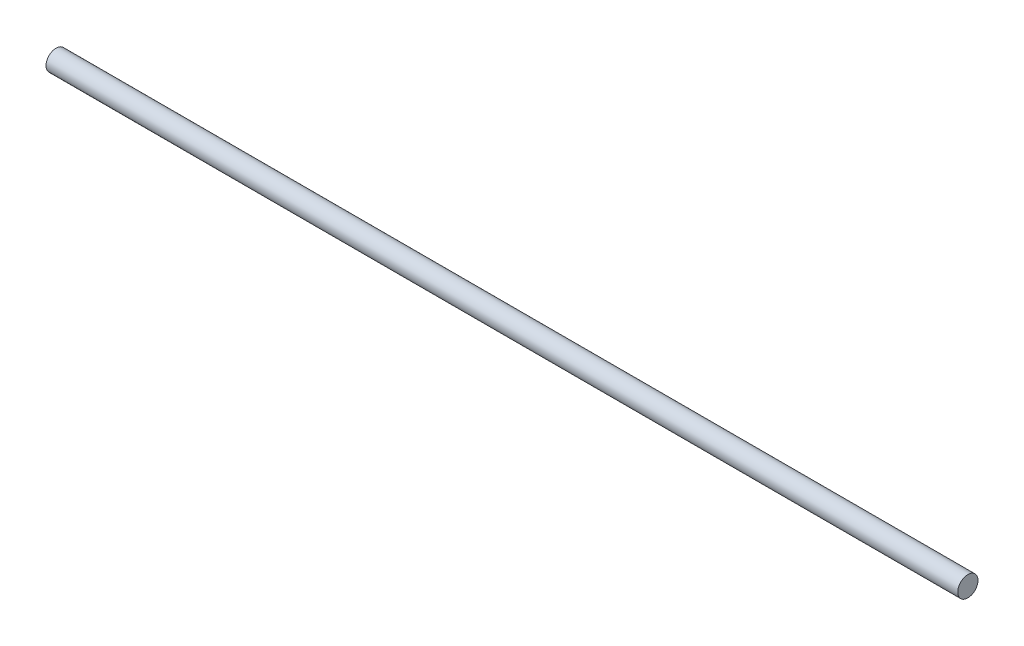
ISO-10303-21;
HEADER;
FILE_DESCRIPTION(('STEP AP214'),'2;1');
FILE_NAME('part.step','',(''),(''),'','','');
FILE_SCHEMA(('AUTOMOTIVE_DESIGN { 1 0 10303 214 1 1 1 1 }'));
ENDSEC;
DATA;
#1=APPLICATION_CONTEXT('core data for automotive mechanical design processes');
#2=APPLICATION_PROTOCOL_DEFINITION('international standard','automotive_design',2000,#1);
#3=PRODUCT_CONTEXT('',#1,'mechanical');
#4=PRODUCT('Part','Part','',(#3));
#5=PRODUCT_RELATED_PRODUCT_CATEGORY('part','',(#4));
#6=PRODUCT_DEFINITION_FORMATION('','',#4);
#7=PRODUCT_DEFINITION_CONTEXT('part definition',#1,'design');
#8=PRODUCT_DEFINITION('design','',#6,#7);
#9=PRODUCT_DEFINITION_SHAPE('','',#8);
#10=(LENGTH_UNIT() NAMED_UNIT(*) SI_UNIT(.MILLI.,.METRE.));
#11=(NAMED_UNIT(*) PLANE_ANGLE_UNIT() SI_UNIT($,.RADIAN.));
#12=(NAMED_UNIT(*) SI_UNIT($,.STERADIAN.) SOLID_ANGLE_UNIT());
#13=UNCERTAINTY_MEASURE_WITH_UNIT(LENGTH_MEASURE(1.E-05),#10,'distance_accuracy_value','');
#14=(GEOMETRIC_REPRESENTATION_CONTEXT(3) GLOBAL_UNCERTAINTY_ASSIGNED_CONTEXT((#13)) GLOBAL_UNIT_ASSIGNED_CONTEXT((#10,
#11,#12)) REPRESENTATION_CONTEXT('',''));
#15=CARTESIAN_POINT('',(0.,0.,0.));
#16=DIRECTION('',(0.,0.,1.));
#17=DIRECTION('',(1.,0.,0.));
#18=AXIS2_PLACEMENT_3D('',#15,#16,#17);
#19=CARTESIAN_POINT('',(214.3125,0.,0.));
#20=DIRECTION('',(-1.,0.,0.));
#21=DIRECTION('',(0.,0.,1.));
#22=AXIS2_PLACEMENT_3D('',#19,#20,#21);
#23=CYLINDRICAL_SURFACE('',#22,4.7625);
#24=CARTESIAN_POINT('',(214.3125,0.,0.));
#25=DIRECTION('',(1.,0.,0.));
#26=DIRECTION('',(0.,0.,-1.));
#27=AXIS2_PLACEMENT_3D('',#24,#25,#26);
#28=CIRCLE('',#27,4.7625);
#29=CARTESIAN_POINT('',(214.3125,0.,-4.7625));
#30=VERTEX_POINT('',#29);
#31=EDGE_CURVE('E10',#30,#30,#28,.T.);
#32=ORIENTED_EDGE('',*,*,#31,.F.);
#33=EDGE_LOOP('',(#32));
#34=FACE_BOUND('',#33,.T.);
#35=CARTESIAN_POINT('',(-214.3125,0.,0.));
#36=DIRECTION('',(1.,0.,0.));
#37=DIRECTION('',(0.,0.,-1.));
#38=AXIS2_PLACEMENT_3D('',#35,#36,#37);
#39=CIRCLE('',#38,4.7625);
#40=CARTESIAN_POINT('',(-214.3125,0.,-4.7625));
#41=VERTEX_POINT('',#40);
#42=EDGE_CURVE('E33',#41,#41,#39,.T.);
#43=ORIENTED_EDGE('',*,*,#42,.T.);
#44=EDGE_LOOP('',(#43));
#45=FACE_BOUND('',#44,.T.);
#46=ADVANCED_FACE('F30',(#34,#45),#23,.T.);
#47=CARTESIAN_POINT('',(214.3125,0.,0.));
#48=DIRECTION('',(1.,0.,0.));
#49=DIRECTION('',(0.,0.,-1.));
#50=AXIS2_PLACEMENT_3D('',#47,#48,#49);
#51=PLANE('',#50);
#52=ORIENTED_EDGE('',*,*,#31,.T.);
#53=EDGE_LOOP('',(#52));
#54=FACE_BOUND('',#53,.T.);
#55=ADVANCED_FACE('F45',(#54),#51,.T.);
#56=CARTESIAN_POINT('',(-214.3125,0.,0.));
#57=DIRECTION('',(1.,0.,0.));
#58=DIRECTION('',(0.,0.,-1.));
#59=AXIS2_PLACEMENT_3D('',#56,#57,#58);
#60=PLANE('',#59);
#61=ORIENTED_EDGE('',*,*,#42,.F.);
#62=EDGE_LOOP('',(#61));
#63=FACE_BOUND('',#62,.T.);
#64=ADVANCED_FACE('F43',(#63),#60,.F.);
#65=CLOSED_SHELL('',(#46,#55,#64));
#66=MANIFOLD_SOLID_BREP('B2',#65);
#67=ADVANCED_BREP_SHAPE_REPRESENTATION('',(#18,#66),#14);
#68=SHAPE_DEFINITION_REPRESENTATION(#9,#67);
ENDSEC;
END-ISO-10303-21;
